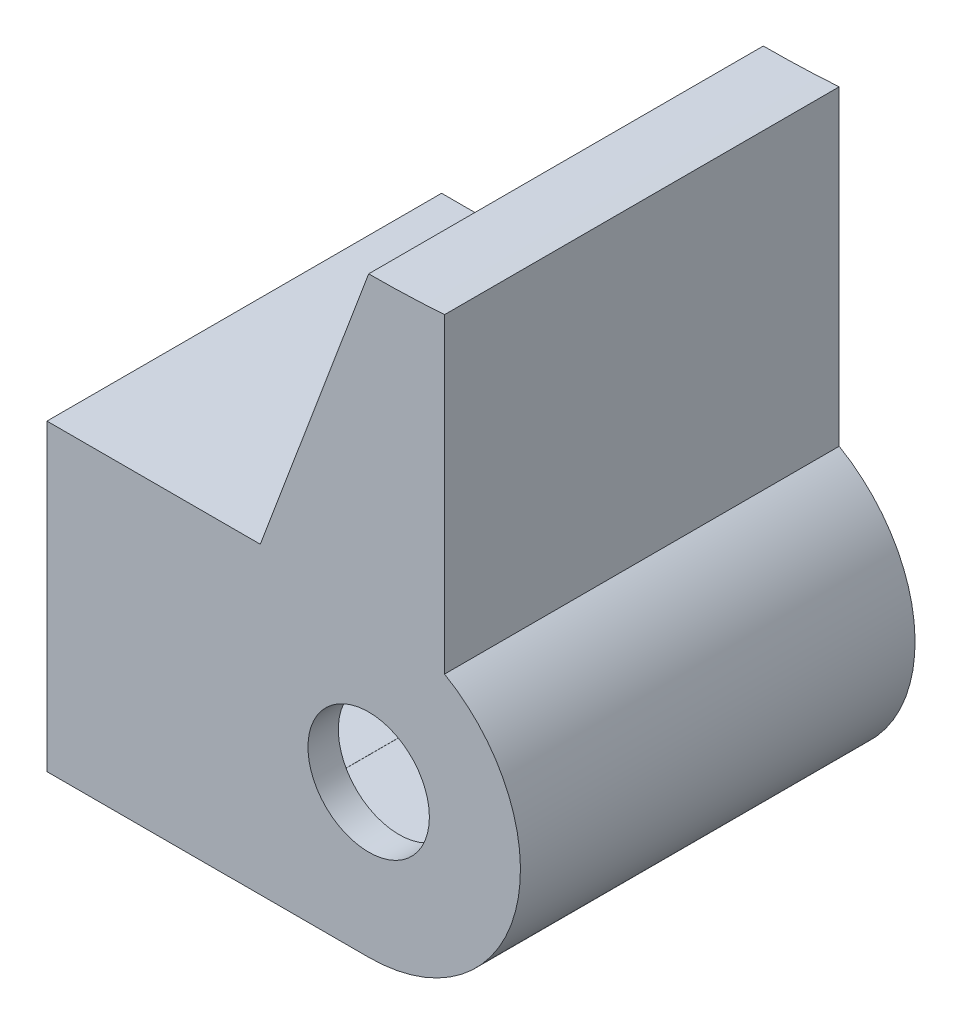
ISO-10303-21;
HEADER;
FILE_DESCRIPTION(('STEP AP214'),'2;1');
FILE_NAME('part.step','',(''),(''),'','','');
FILE_SCHEMA(('AUTOMOTIVE_DESIGN { 1 0 10303 214 1 1 1 1 }'));
ENDSEC;
DATA;
#1=APPLICATION_CONTEXT('core data for automotive mechanical design processes');
#2=APPLICATION_PROTOCOL_DEFINITION('international standard','automotive_design',2000,#1);
#3=PRODUCT_CONTEXT('',#1,'mechanical');
#4=PRODUCT('Part','Part','',(#3));
#5=PRODUCT_RELATED_PRODUCT_CATEGORY('part','',(#4));
#6=PRODUCT_DEFINITION_FORMATION('','',#4);
#7=PRODUCT_DEFINITION_CONTEXT('part definition',#1,'design');
#8=PRODUCT_DEFINITION('design','',#6,#7);
#9=PRODUCT_DEFINITION_SHAPE('','',#8);
#10=(LENGTH_UNIT() NAMED_UNIT(*) SI_UNIT(.MILLI.,.METRE.));
#11=(NAMED_UNIT(*) PLANE_ANGLE_UNIT() SI_UNIT($,.RADIAN.));
#12=(NAMED_UNIT(*) SI_UNIT($,.STERADIAN.) SOLID_ANGLE_UNIT());
#13=UNCERTAINTY_MEASURE_WITH_UNIT(LENGTH_MEASURE(1.E-05),#10,'distance_accuracy_value','');
#14=(GEOMETRIC_REPRESENTATION_CONTEXT(3) GLOBAL_UNCERTAINTY_ASSIGNED_CONTEXT((#13)) GLOBAL_UNIT_ASSIGNED_CONTEXT((#10,
#11,#12)) REPRESENTATION_CONTEXT('',''));
#15=CARTESIAN_POINT('',(0.,0.,0.));
#16=DIRECTION('',(0.,0.,1.));
#17=DIRECTION('',(1.,0.,0.));
#18=AXIS2_PLACEMENT_3D('',#15,#16,#17);
#19=CARTESIAN_POINT('',(645.,43.3012701892221,130.));
#20=DIRECTION('',(-1.,0.,0.));
#21=DIRECTION('',(0.,0.,1.));
#22=AXIS2_PLACEMENT_3D('',#19,#20,#21);
#23=PLANE('',#22);
#24=DIRECTION('',(0.,1.,0.));
#25=VECTOR('',#24,1.);
#26=CARTESIAN_POINT('',(645.,43.3012701892221,0.));
#27=LINE('',#26,#25);
#28=CARTESIAN_POINT('',(645.,43.3012701892221,0.));
#29=VERTEX_POINT('',#28);
#30=CARTESIAN_POINT('',(645.,145.857170879338,0.));
#31=VERTEX_POINT('',#30);
#32=EDGE_CURVE('E149',#29,#31,#27,.T.);
#33=ORIENTED_EDGE('',*,*,#32,.T.);
#34=DIRECTION('',(0.,0.,-1.));
#35=VECTOR('',#34,1.);
#36=CARTESIAN_POINT('',(645.,145.857170879338,130.));
#37=LINE('',#36,#35);
#38=CARTESIAN_POINT('',(645.,145.857170879338,130.));
#39=VERTEX_POINT('',#38);
#40=EDGE_CURVE('E11',#39,#31,#37,.T.);
#41=ORIENTED_EDGE('',*,*,#40,.F.);
#42=DIRECTION('',(0.,1.,0.));
#43=VECTOR('',#42,1.);
#44=CARTESIAN_POINT('',(645.,43.3012701892221,130.));
#45=LINE('',#44,#43);
#46=CARTESIAN_POINT('',(645.,43.3012701892221,130.));
#47=VERTEX_POINT('',#46);
#48=EDGE_CURVE('E99',#47,#39,#45,.T.);
#49=ORIENTED_EDGE('',*,*,#48,.F.);
#50=DIRECTION('',(0.,0.,-1.));
#51=VECTOR('',#50,1.);
#52=CARTESIAN_POINT('',(645.,43.3012701892221,130.));
#53=LINE('',#52,#51);
#54=EDGE_CURVE('E148',#47,#29,#53,.T.);
#55=ORIENTED_EDGE('',*,*,#54,.T.);
#56=EDGE_LOOP('',(#33,#41,#49,#55));
#57=FACE_BOUND('',#56,.T.);
#58=ADVANCED_FACE('F35',(#57),#23,.F.);
#59=CARTESIAN_POINT('',(620.,510.,130.));
#60=DIRECTION('',(0.,0.,-1.));
#61=DIRECTION('',(-1.,0.,0.));
#62=AXIS2_PLACEMENT_3D('',#59,#60,#61);
#63=CYLINDRICAL_SURFACE('',#62,365.);
#64=CARTESIAN_POINT('',(620.,510.,0.));
#65=DIRECTION('',(0.,0.,1.));
#66=DIRECTION('',(1.,0.,0.));
#67=AXIS2_PLACEMENT_3D('',#64,#65,#66);
#68=CIRCLE('',#67,365.);
#69=CARTESIAN_POINT('',(620.,145.,0.));
#70=VERTEX_POINT('',#69);
#71=EDGE_CURVE('E152',#70,#31,#68,.T.);
#72=ORIENTED_EDGE('',*,*,#71,.F.);
#73=DIRECTION('',(0.,0.,-1.));
#74=VECTOR('',#73,1.);
#75=CARTESIAN_POINT('',(620.,145.,130.));
#76=LINE('',#75,#74);
#77=CARTESIAN_POINT('',(620.,145.,130.));
#78=VERTEX_POINT('',#77);
#79=EDGE_CURVE('E42',#78,#70,#76,.T.);
#80=ORIENTED_EDGE('',*,*,#79,.F.);
#81=CARTESIAN_POINT('',(620.,510.,130.));
#82=DIRECTION('',(0.,0.,1.));
#83=DIRECTION('',(1.,0.,0.));
#84=AXIS2_PLACEMENT_3D('',#81,#82,#83);
#85=CIRCLE('',#84,365.);
#86=EDGE_CURVE('E212',#78,#39,#85,.T.);
#87=ORIENTED_EDGE('',*,*,#86,.T.);
#88=ORIENTED_EDGE('',*,*,#40,.T.);
#89=EDGE_LOOP('',(#72,#80,#87,#88));
#90=FACE_BOUND('',#89,.T.);
#91=ADVANCED_FACE('F192',(#90),#63,.F.);
#92=CARTESIAN_POINT('',(584.288816548161,49.9999999999999,130.));
#93=DIRECTION('',(-0.936049699495071,0.351867816196918,0.));
#94=DIRECTION('',(-0.351867816196918,-0.936049699495071,0.));
#95=AXIS2_PLACEMENT_3D('',#92,#93,#94);
#96=PLANE('',#95);
#97=DIRECTION('',(0.351867816196918,0.936049699495071,0.));
#98=VECTOR('',#97,1.);
#99=CARTESIAN_POINT('',(584.288816548161,49.9999999999999,0.));
#100=LINE('',#99,#98);
#101=CARTESIAN_POINT('',(584.288816548161,49.9999999999999,0.));
#102=VERTEX_POINT('',#101);
#103=EDGE_CURVE('E156',#102,#70,#100,.T.);
#104=ORIENTED_EDGE('',*,*,#103,.F.);
#105=DIRECTION('',(0.,0.,-1.));
#106=VECTOR('',#105,1.);
#107=CARTESIAN_POINT('',(584.288816548161,49.9999999999999,130.));
#108=LINE('',#107,#106);
#109=CARTESIAN_POINT('',(584.288816548161,49.9999999999999,130.));
#110=VERTEX_POINT('',#109);
#111=EDGE_CURVE('E182',#110,#102,#108,.T.);
#112=ORIENTED_EDGE('',*,*,#111,.F.);
#113=DIRECTION('',(0.351867816196918,0.936049699495071,0.));
#114=VECTOR('',#113,1.);
#115=CARTESIAN_POINT('',(584.288816548161,49.9999999999999,130.));
#116=LINE('',#115,#114);
#117=EDGE_CURVE('E189',#110,#78,#116,.T.);
#118=ORIENTED_EDGE('',*,*,#117,.T.);
#119=ORIENTED_EDGE('',*,*,#79,.T.);
#120=EDGE_LOOP('',(#104,#112,#118,#119));
#121=FACE_BOUND('',#120,.T.);
#122=ADVANCED_FACE('F187',(#121),#96,.T.);
#123=CARTESIAN_POINT('',(584.288816548161,49.9999999999999,130.));
#124=DIRECTION('',(0.,-1.,0.));
#125=DIRECTION('',(0.,0.,-1.));
#126=AXIS2_PLACEMENT_3D('',#123,#124,#125);
#127=PLANE('',#126);
#128=DIRECTION('',(-1.,0.,0.));
#129=VECTOR('',#128,1.);
#130=CARTESIAN_POINT('',(584.288816548161,49.9999999999999,0.));
#131=LINE('',#130,#129);
#132=CARTESIAN_POINT('',(514.017492235498,49.9999999999999,0.));
#133=VERTEX_POINT('',#132);
#134=EDGE_CURVE('E159',#102,#133,#131,.T.);
#135=ORIENTED_EDGE('',*,*,#134,.T.);
#136=DIRECTION('',(0.,0.,-1.));
#137=VECTOR('',#136,1.);
#138=CARTESIAN_POINT('',(514.017492235498,49.9999999999999,130.));
#139=LINE('',#138,#137);
#140=CARTESIAN_POINT('',(514.017492235498,49.9999999999999,130.));
#141=VERTEX_POINT('',#140);
#142=EDGE_CURVE('E179',#141,#133,#139,.T.);
#143=ORIENTED_EDGE('',*,*,#142,.F.);
#144=DIRECTION('',(-1.,0.,0.));
#145=VECTOR('',#144,1.);
#146=CARTESIAN_POINT('',(584.288816548161,49.9999999999999,130.));
#147=LINE('',#146,#145);
#148=EDGE_CURVE('E208',#110,#141,#147,.T.);
#149=ORIENTED_EDGE('',*,*,#148,.F.);
#150=ORIENTED_EDGE('',*,*,#111,.T.);
#151=EDGE_LOOP('',(#135,#143,#149,#150));
#152=FACE_BOUND('',#151,.T.);
#153=ADVANCED_FACE('F200',(#152),#127,.F.);
#154=CARTESIAN_POINT('',(514.017492235498,22.6759038658315,130.));
#155=DIRECTION('',(1.,0.,0.));
#156=DIRECTION('',(0.,0.,-1.));
#157=AXIS2_PLACEMENT_3D('',#154,#155,#156);
#158=PLANE('',#157);
#159=DIRECTION('',(0.,-1.,0.));
#160=VECTOR('',#159,1.);
#161=CARTESIAN_POINT('',(514.017492235498,22.6759038658315,0.));
#162=LINE('',#161,#160);
#163=CARTESIAN_POINT('',(514.017492235498,39.9999999999999,0.));
#164=VERTEX_POINT('',#163);
#165=EDGE_CURVE('E163',#133,#164,#162,.T.);
#166=ORIENTED_EDGE('',*,*,#165,.T.);
#167=DIRECTION('',(0.,0.,-1.));
#168=VECTOR('',#167,1.);
#169=CARTESIAN_POINT('',(514.017492235498,39.9999999999999,120.));
#170=LINE('',#169,#168);
#171=CARTESIAN_POINT('',(514.017492235498,39.9999999999999,120.));
#172=VERTEX_POINT('',#171);
#173=EDGE_CURVE('E237',#172,#164,#170,.T.);
#174=ORIENTED_EDGE('',*,*,#173,.F.);
#175=DIRECTION('',(0.,1.,0.));
#176=VECTOR('',#175,1.);
#177=CARTESIAN_POINT('',(514.017492235498,39.9999999999999,120.));
#178=LINE('',#177,#176);
#179=CARTESIAN_POINT('',(514.017492235498,-40.0247511001106,120.));
#180=VERTEX_POINT('',#179);
#181=EDGE_CURVE('E282',#180,#172,#178,.T.);
#182=ORIENTED_EDGE('',*,*,#181,.F.);
#183=DIRECTION('',(0.,0.,-1.));
#184=VECTOR('',#183,1.);
#185=CARTESIAN_POINT('',(514.017492235498,-40.0247511001106,120.));
#186=LINE('',#185,#184);
#187=CARTESIAN_POINT('',(514.017492235498,-40.0247511001106,0.));
#188=VERTEX_POINT('',#187);
#189=EDGE_CURVE('E279',#180,#188,#186,.T.);
#190=ORIENTED_EDGE('',*,*,#189,.T.);
#191=CARTESIAN_POINT('',(514.017492235498,-50.0247511001106,0.));
#192=VERTEX_POINT('',#191);
#193=EDGE_CURVE('E162',#188,#192,#162,.T.);
#194=ORIENTED_EDGE('',*,*,#193,.T.);
#195=DIRECTION('',(0.,0.,-1.));
#196=VECTOR('',#195,1.);
#197=CARTESIAN_POINT('',(514.017492235498,-50.0247511001106,130.));
#198=LINE('',#197,#196);
#199=CARTESIAN_POINT('',(514.017492235498,-50.0247511001106,130.));
#200=VERTEX_POINT('',#199);
#201=EDGE_CURVE('E176',#200,#192,#198,.T.);
#202=ORIENTED_EDGE('',*,*,#201,.F.);
#203=DIRECTION('',(0.,-1.,0.));
#204=VECTOR('',#203,1.);
#205=CARTESIAN_POINT('',(514.017492235498,49.9999999999999,130.));
#206=LINE('',#205,#204);
#207=EDGE_CURVE('E143',#141,#200,#206,.T.);
#208=ORIENTED_EDGE('',*,*,#207,.F.);
#209=ORIENTED_EDGE('',*,*,#142,.T.);
#210=EDGE_LOOP('',(#166,#174,#182,#190,#194,#202,#208,#209));
#211=FACE_BOUND('',#210,.T.);
#212=ADVANCED_FACE('F204',(#211),#158,.F.);
#213=CARTESIAN_POINT('',(514.017492235498,-50.0247511001106,130.));
#214=DIRECTION('',(0.,1.,0.));
#215=DIRECTION('',(0.,0.,1.));
#216=AXIS2_PLACEMENT_3D('',#213,#214,#215);
#217=PLANE('',#216);
#218=DIRECTION('',(1.,0.,0.));
#219=VECTOR('',#218,1.);
#220=CARTESIAN_POINT('',(514.017492235498,-50.0247511001106,0.));
#221=LINE('',#220,#219);
#222=CARTESIAN_POINT('',(573.946481720412,-50.0247511001106,0.));
#223=VERTEX_POINT('',#222);
#224=EDGE_CURVE('E166',#192,#223,#221,.T.);
#225=ORIENTED_EDGE('',*,*,#224,.T.);
#226=DIRECTION('',(0.,0.,-1.));
#227=VECTOR('',#226,1.);
#228=CARTESIAN_POINT('',(573.946481720412,-50.0247511001106,130.));
#229=LINE('',#228,#227);
#230=CARTESIAN_POINT('',(573.946481720412,-50.0247511001106,130.));
#231=VERTEX_POINT('',#230);
#232=EDGE_CURVE('E131',#231,#223,#229,.T.);
#233=ORIENTED_EDGE('',*,*,#232,.F.);
#234=DIRECTION('',(1.,0.,0.));
#235=VECTOR('',#234,1.);
#236=CARTESIAN_POINT('',(514.017492235498,-50.0247511001106,130.));
#237=LINE('',#236,#235);
#238=EDGE_CURVE('E140',#200,#231,#237,.T.);
#239=ORIENTED_EDGE('',*,*,#238,.F.);
#240=ORIENTED_EDGE('',*,*,#201,.T.);
#241=EDGE_LOOP('',(#225,#233,#239,#240));
#242=FACE_BOUND('',#241,.T.);
#243=ADVANCED_FACE('F323',(#242),#217,.F.);
#244=CARTESIAN_POINT('',(574.017492235498,-50.,130.));
#245=DIRECTION('',(0.32913492639564,-0.944282902644402,0.));
#246=DIRECTION('',(0.944282902644402,0.32913492639564,0.));
#247=AXIS2_PLACEMENT_3D('',#244,#245,#246);
#248=PLANE('',#247);
#249=DIRECTION('',(-0.944282902644402,-0.32913492639564,0.));
#250=VECTOR('',#249,1.);
#251=CARTESIAN_POINT('',(574.017492235498,-50.,0.));
#252=LINE('',#251,#250);
#253=CARTESIAN_POINT('',(574.017492235498,-50.,0.));
#254=VERTEX_POINT('',#253);
#255=EDGE_CURVE('E128',#254,#223,#252,.T.);
#256=ORIENTED_EDGE('',*,*,#255,.F.);
#257=DIRECTION('',(0.,0.,-1.));
#258=VECTOR('',#257,1.);
#259=CARTESIAN_POINT('',(574.017492235498,-50.,130.));
#260=LINE('',#259,#258);
#261=CARTESIAN_POINT('',(574.017492235498,-50.,130.));
#262=VERTEX_POINT('',#261);
#263=EDGE_CURVE('E122',#262,#254,#260,.T.);
#264=ORIENTED_EDGE('',*,*,#263,.F.);
#265=DIRECTION('',(-0.944282902644402,-0.32913492639564,0.));
#266=VECTOR('',#265,1.);
#267=CARTESIAN_POINT('',(574.017492235498,-50.,130.));
#268=LINE('',#267,#266);
#269=EDGE_CURVE('E126',#262,#231,#268,.T.);
#270=ORIENTED_EDGE('',*,*,#269,.T.);
#271=ORIENTED_EDGE('',*,*,#232,.T.);
#272=EDGE_LOOP('',(#256,#264,#270,#271));
#273=FACE_BOUND('',#272,.T.);
#274=ADVANCED_FACE('F124',(#273),#248,.T.);
#275=CARTESIAN_POINT('',(574.017492235498,-50.,130.));
#276=DIRECTION('',(0.,1.,0.));
#277=DIRECTION('',(0.,0.,1.));
#278=AXIS2_PLACEMENT_3D('',#275,#276,#277);
#279=PLANE('',#278);
#280=DIRECTION('',(1.,0.,0.));
#281=VECTOR('',#280,1.);
#282=CARTESIAN_POINT('',(574.017492235498,-50.,0.));
#283=LINE('',#282,#281);
#284=CARTESIAN_POINT('',(620.,-50.,0.));
#285=VERTEX_POINT('',#284);
#286=EDGE_CURVE('E170',#254,#285,#283,.T.);
#287=ORIENTED_EDGE('',*,*,#286,.T.);
#288=DIRECTION('',(0.,0.,-1.));
#289=VECTOR('',#288,1.);
#290=CARTESIAN_POINT('',(620.,-50.,130.));
#291=LINE('',#290,#289);
#292=CARTESIAN_POINT('',(620.,-50.,130.));
#293=VERTEX_POINT('',#292);
#294=EDGE_CURVE('E132',#293,#285,#291,.T.);
#295=ORIENTED_EDGE('',*,*,#294,.F.);
#296=DIRECTION('',(1.,0.,0.));
#297=VECTOR('',#296,1.);
#298=CARTESIAN_POINT('',(574.017492235498,-50.,130.));
#299=LINE('',#298,#297);
#300=EDGE_CURVE('E135',#262,#293,#299,.T.);
#301=ORIENTED_EDGE('',*,*,#300,.F.);
#302=ORIENTED_EDGE('',*,*,#263,.T.);
#303=EDGE_LOOP('',(#287,#295,#301,#302));
#304=FACE_BOUND('',#303,.T.);
#305=ADVANCED_FACE('F136',(#304),#279,.F.);
#306=CARTESIAN_POINT('',(620.,0.,130.));
#307=DIRECTION('',(0.,0.,-1.));
#308=DIRECTION('',(-1.,0.,0.));
#309=AXIS2_PLACEMENT_3D('',#306,#307,#308);
#310=CYLINDRICAL_SURFACE('',#309,50.);
#311=CARTESIAN_POINT('',(620.,0.,0.));
#312=DIRECTION('',(0.,0.,1.));
#313=DIRECTION('',(1.,0.,0.));
#314=AXIS2_PLACEMENT_3D('',#311,#312,#313);
#315=CIRCLE('',#314,50.);
#316=EDGE_CURVE('E93',#285,#29,#315,.T.);
#317=ORIENTED_EDGE('',*,*,#316,.T.);
#318=ORIENTED_EDGE('',*,*,#54,.F.);
#319=CARTESIAN_POINT('',(620.,0.,130.));
#320=DIRECTION('',(0.,0.,1.));
#321=DIRECTION('',(1.,0.,0.));
#322=AXIS2_PLACEMENT_3D('',#319,#320,#321);
#323=CIRCLE('',#322,50.);
#324=EDGE_CURVE('E58',#293,#47,#323,.T.);
#325=ORIENTED_EDGE('',*,*,#324,.F.);
#326=ORIENTED_EDGE('',*,*,#294,.T.);
#327=EDGE_LOOP('',(#317,#318,#325,#326));
#328=FACE_BOUND('',#327,.T.);
#329=ADVANCED_FACE('F304',(#328),#310,.T.);
#330=CARTESIAN_POINT('',(620.,510.,130.));
#331=DIRECTION('',(0.,0.,1.));
#332=DIRECTION('',(1.,0.,0.));
#333=AXIS2_PLACEMENT_3D('',#330,#331,#332);
#334=PLANE('',#333);
#335=CARTESIAN_POINT('',(620.,0.,130.));
#336=DIRECTION('',(0.,0.,1.));
#337=DIRECTION('',(1.,0.,0.));
#338=AXIS2_PLACEMENT_3D('',#335,#336,#337);
#339=CIRCLE('',#338,20.0000000000001);
#340=CARTESIAN_POINT('',(640.,0.,130.));
#341=VERTEX_POINT('',#340);
#342=EDGE_CURVE('E288',#341,#341,#339,.T.);
#343=ORIENTED_EDGE('',*,*,#342,.F.);
#344=EDGE_LOOP('',(#343));
#345=FACE_BOUND('',#344,.T.);
#346=ORIENTED_EDGE('',*,*,#48,.T.);
#347=ORIENTED_EDGE('',*,*,#86,.F.);
#348=ORIENTED_EDGE('',*,*,#117,.F.);
#349=ORIENTED_EDGE('',*,*,#148,.T.);
#350=ORIENTED_EDGE('',*,*,#207,.T.);
#351=ORIENTED_EDGE('',*,*,#238,.T.);
#352=ORIENTED_EDGE('',*,*,#269,.F.);
#353=ORIENTED_EDGE('',*,*,#300,.T.);
#354=ORIENTED_EDGE('',*,*,#324,.T.);
#355=EDGE_LOOP('',(#346,#347,#348,#349,#350,#351,#352,#353,#354));
#356=FACE_BOUND('',#355,.T.);
#357=ADVANCED_FACE('F138',(#345,#356),#334,.T.);
#358=CARTESIAN_POINT('',(620.,510.,0.));
#359=DIRECTION('',(0.,0.,1.));
#360=DIRECTION('',(1.,0.,0.));
#361=AXIS2_PLACEMENT_3D('',#358,#359,#360);
#362=PLANE('',#361);
#363=DIRECTION('',(-1.,0.,0.));
#364=VECTOR('',#363,1.);
#365=CARTESIAN_POINT('',(584.288816548161,39.9999999999999,0.));
#366=LINE('',#365,#364);
#367=CARTESIAN_POINT('',(591.212938036077,39.9999999999999,0.));
#368=VERTEX_POINT('',#367);
#369=EDGE_CURVE('E220',#368,#164,#366,.T.);
#370=ORIENTED_EDGE('',*,*,#369,.T.);
#371=ORIENTED_EDGE('',*,*,#165,.F.);
#372=ORIENTED_EDGE('',*,*,#134,.F.);
#373=ORIENTED_EDGE('',*,*,#103,.T.);
#374=ORIENTED_EDGE('',*,*,#71,.T.);
#375=ORIENTED_EDGE('',*,*,#32,.F.);
#376=ORIENTED_EDGE('',*,*,#316,.F.);
#377=ORIENTED_EDGE('',*,*,#286,.F.);
#378=ORIENTED_EDGE('',*,*,#255,.T.);
#379=ORIENTED_EDGE('',*,*,#224,.F.);
#380=ORIENTED_EDGE('',*,*,#193,.F.);
#381=DIRECTION('',(1.,0.,0.));
#382=VECTOR('',#381,1.);
#383=CARTESIAN_POINT('',(514.017492235498,-40.0247511001106,0.));
#384=LINE('',#383,#382);
#385=CARTESIAN_POINT('',(572.253647174843,-40.0247511001106,0.));
#386=VERTEX_POINT('',#385);
#387=EDGE_CURVE('E222',#188,#386,#384,.T.);
#388=ORIENTED_EDGE('',*,*,#387,.T.);
#389=DIRECTION('',(-0.944282902644402,-0.32913492639564,0.));
#390=VECTOR('',#389,1.);
#391=CARTESIAN_POINT('',(570.726142971542,-40.557170973556,0.));
#392=LINE('',#391,#390);
#393=CARTESIAN_POINT('',(572.324657689929,-40.,0.));
#394=VERTEX_POINT('',#393);
#395=EDGE_CURVE('E225',#394,#386,#392,.T.);
#396=ORIENTED_EDGE('',*,*,#395,.F.);
#397=DIRECTION('',(1.,0.,0.));
#398=VECTOR('',#397,1.);
#399=CARTESIAN_POINT('',(574.017492235498,-40.,0.));
#400=LINE('',#399,#398);
#401=CARTESIAN_POINT('',(620.,-40.,0.));
#402=VERTEX_POINT('',#401);
#403=EDGE_CURVE('E228',#394,#402,#400,.T.);
#404=ORIENTED_EDGE('',*,*,#403,.T.);
#405=CARTESIAN_POINT('',(620.,0.,0.));
#406=DIRECTION('',(0.,0.,1.));
#407=DIRECTION('',(1.,0.,0.));
#408=AXIS2_PLACEMENT_3D('',#405,#406,#407);
#409=CIRCLE('',#408,40.);
#410=CARTESIAN_POINT('',(635.,37.0809924354784,0.));
#411=VERTEX_POINT('',#410);
#412=EDGE_CURVE('E231',#402,#411,#409,.T.);
#413=ORIENTED_EDGE('',*,*,#412,.T.);
#414=DIRECTION('',(0.,1.,0.));
#415=VECTOR('',#414,1.);
#416=CARTESIAN_POINT('',(635.,43.3012701892221,0.));
#417=LINE('',#416,#415);
#418=CARTESIAN_POINT('',(635.,135.300120096096,0.));
#419=VERTEX_POINT('',#418);
#420=EDGE_CURVE('E218',#411,#419,#417,.T.);
#421=ORIENTED_EDGE('',*,*,#420,.T.);
#422=CARTESIAN_POINT('',(620.,510.,0.));
#423=DIRECTION('',(0.,0.,1.));
#424=DIRECTION('',(1.,0.,0.));
#425=AXIS2_PLACEMENT_3D('',#422,#423,#424);
#426=CIRCLE('',#425,375.);
#427=CARTESIAN_POINT('',(626.948321549469,135.0643777558,0.));
#428=VERTEX_POINT('',#427);
#429=EDGE_CURVE('E215',#428,#419,#426,.T.);
#430=ORIENTED_EDGE('',*,*,#429,.F.);
#431=DIRECTION('',(0.351867816196918,0.936049699495071,0.));
#432=VECTOR('',#431,1.);
#433=CARTESIAN_POINT('',(593.649313543112,46.4813218380307,0.));
#434=LINE('',#433,#432);
#435=EDGE_CURVE('E49',#368,#428,#434,.T.);
#436=ORIENTED_EDGE('',*,*,#435,.F.);
#437=EDGE_LOOP('',(#370,#371,#372,#373,#374,#375,#376,#377,#378,#379,#380,#388,#396,#404,#413,
#421,#430,#436));
#438=FACE_BOUND('',#437,.T.);
#439=ADVANCED_FACE('F197',(#438),#362,.F.);
#440=CARTESIAN_POINT('',(635.,43.3012701892221,130.));
#441=DIRECTION('',(-1.,0.,0.));
#442=DIRECTION('',(0.,0.,1.));
#443=AXIS2_PLACEMENT_3D('',#440,#441,#442);
#444=PLANE('',#443);
#445=ORIENTED_EDGE('',*,*,#420,.F.);
#446=DIRECTION('',(0.,0.,-1.));
#447=VECTOR('',#446,1.);
#448=CARTESIAN_POINT('',(635.,37.0809924354784,120.));
#449=LINE('',#448,#447);
#450=CARTESIAN_POINT('',(635.,37.0809924354784,120.));
#451=VERTEX_POINT('',#450);
#452=EDGE_CURVE('E241',#451,#411,#449,.T.);
#453=ORIENTED_EDGE('',*,*,#452,.F.);
#454=DIRECTION('',(0.,1.,0.));
#455=VECTOR('',#454,1.);
#456=CARTESIAN_POINT('',(635.,43.3012701892221,120.));
#457=LINE('',#456,#455);
#458=CARTESIAN_POINT('',(635.,135.300120096096,120.));
#459=VERTEX_POINT('',#458);
#460=EDGE_CURVE('E234',#451,#459,#457,.T.);
#461=ORIENTED_EDGE('',*,*,#460,.T.);
#462=DIRECTION('',(0.,0.,-1.));
#463=VECTOR('',#462,1.);
#464=CARTESIAN_POINT('',(635.,135.300120096096,120.));
#465=LINE('',#464,#463);
#466=EDGE_CURVE('E153',#459,#419,#465,.T.);
#467=ORIENTED_EDGE('',*,*,#466,.T.);
#468=EDGE_LOOP('',(#445,#453,#461,#467));
#469=FACE_BOUND('',#468,.T.);
#470=ADVANCED_FACE('F310',(#469),#444,.T.);
#471=CARTESIAN_POINT('',(620.,510.,130.));
#472=DIRECTION('',(0.,0.,-1.));
#473=DIRECTION('',(-1.,0.,0.));
#474=AXIS2_PLACEMENT_3D('',#471,#472,#473);
#475=CYLINDRICAL_SURFACE('',#474,375.);
#476=ORIENTED_EDGE('',*,*,#429,.T.);
#477=ORIENTED_EDGE('',*,*,#466,.F.);
#478=CARTESIAN_POINT('',(620.,510.,120.));
#479=DIRECTION('',(0.,0.,1.));
#480=DIRECTION('',(1.,0.,0.));
#481=AXIS2_PLACEMENT_3D('',#478,#479,#480);
#482=CIRCLE('',#481,375.);
#483=CARTESIAN_POINT('',(626.948321549469,135.0643777558,120.));
#484=VERTEX_POINT('',#483);
#485=EDGE_CURVE('E267',#484,#459,#482,.T.);
#486=ORIENTED_EDGE('',*,*,#485,.F.);
#487=DIRECTION('',(0.,0.,-1.));
#488=VECTOR('',#487,1.);
#489=CARTESIAN_POINT('',(626.948321549469,135.0643777558,120.));
#490=LINE('',#489,#488);
#491=EDGE_CURVE('E269',#484,#428,#490,.T.);
#492=ORIENTED_EDGE('',*,*,#491,.T.);
#493=EDGE_LOOP('',(#476,#477,#486,#492));
#494=FACE_BOUND('',#493,.T.);
#495=ADVANCED_FACE('F436',(#494),#475,.T.);
#496=CARTESIAN_POINT('',(593.649313543112,46.4813218380307,130.));
#497=DIRECTION('',(-0.936049699495071,0.351867816196918,0.));
#498=DIRECTION('',(-0.351867816196918,-0.936049699495071,0.));
#499=AXIS2_PLACEMENT_3D('',#496,#497,#498);
#500=PLANE('',#499);
#501=ORIENTED_EDGE('',*,*,#435,.T.);
#502=ORIENTED_EDGE('',*,*,#491,.F.);
#503=DIRECTION('',(0.351867816196918,0.936049699495071,0.));
#504=VECTOR('',#503,1.);
#505=CARTESIAN_POINT('',(593.649313543112,46.4813218380307,120.));
#506=LINE('',#505,#504);
#507=CARTESIAN_POINT('',(591.212938036077,39.9999999999999,120.));
#508=VERTEX_POINT('',#507);
#509=EDGE_CURVE('E264',#508,#484,#506,.T.);
#510=ORIENTED_EDGE('',*,*,#509,.F.);
#511=DIRECTION('',(0.,0.,-1.));
#512=VECTOR('',#511,1.);
#513=CARTESIAN_POINT('',(591.212938036077,39.9999999999999,130.));
#514=LINE('',#513,#512);
#515=EDGE_CURVE('E261',#508,#368,#514,.T.);
#516=ORIENTED_EDGE('',*,*,#515,.T.);
#517=EDGE_LOOP('',(#501,#502,#510,#516));
#518=FACE_BOUND('',#517,.T.);
#519=ADVANCED_FACE('F377',(#518),#500,.F.);
#520=CARTESIAN_POINT('',(584.288816548161,39.9999999999999,130.));
#521=DIRECTION('',(0.,-1.,0.));
#522=DIRECTION('',(0.,0.,-1.));
#523=AXIS2_PLACEMENT_3D('',#520,#521,#522);
#524=PLANE('',#523);
#525=ORIENTED_EDGE('',*,*,#369,.F.);
#526=ORIENTED_EDGE('',*,*,#515,.F.);
#527=DIRECTION('',(-1.,0.,0.));
#528=VECTOR('',#527,1.);
#529=CARTESIAN_POINT('',(584.288816548161,39.9999999999999,120.));
#530=LINE('',#529,#528);
#531=EDGE_CURVE('E258',#508,#172,#530,.T.);
#532=ORIENTED_EDGE('',*,*,#531,.T.);
#533=ORIENTED_EDGE('',*,*,#173,.T.);
#534=EDGE_LOOP('',(#525,#526,#532,#533));
#535=FACE_BOUND('',#534,.T.);
#536=ADVANCED_FACE('F371',(#535),#524,.T.);
#537=CARTESIAN_POINT('',(514.017492235498,-40.0247511001106,130.));
#538=DIRECTION('',(0.,1.,0.));
#539=DIRECTION('',(0.,0.,1.));
#540=AXIS2_PLACEMENT_3D('',#537,#538,#539);
#541=PLANE('',#540);
#542=ORIENTED_EDGE('',*,*,#387,.F.);
#543=ORIENTED_EDGE('',*,*,#189,.F.);
#544=DIRECTION('',(1.,0.,0.));
#545=VECTOR('',#544,1.);
#546=CARTESIAN_POINT('',(514.017492235498,-40.0247511001106,120.));
#547=LINE('',#546,#545);
#548=CARTESIAN_POINT('',(572.253647174843,-40.0247511001106,120.));
#549=VERTEX_POINT('',#548);
#550=EDGE_CURVE('E252',#180,#549,#547,.T.);
#551=ORIENTED_EDGE('',*,*,#550,.T.);
#552=DIRECTION('',(0.,0.,-1.));
#553=VECTOR('',#552,1.);
#554=CARTESIAN_POINT('',(572.253647174843,-40.0247511001106,130.));
#555=LINE('',#554,#553);
#556=EDGE_CURVE('E255',#549,#386,#555,.T.);
#557=ORIENTED_EDGE('',*,*,#556,.T.);
#558=EDGE_LOOP('',(#542,#543,#551,#557));
#559=FACE_BOUND('',#558,.T.);
#560=ADVANCED_FACE('F376',(#559),#541,.T.);
#561=CARTESIAN_POINT('',(570.726142971542,-40.557170973556,130.));
#562=DIRECTION('',(0.32913492639564,-0.944282902644402,0.));
#563=DIRECTION('',(0.944282902644402,0.32913492639564,0.));
#564=AXIS2_PLACEMENT_3D('',#561,#562,#563);
#565=PLANE('',#564);
#566=ORIENTED_EDGE('',*,*,#395,.T.);
#567=ORIENTED_EDGE('',*,*,#556,.F.);
#568=DIRECTION('',(-0.944282902644402,-0.32913492639564,0.));
#569=VECTOR('',#568,1.);
#570=CARTESIAN_POINT('',(570.726142971542,-40.557170973556,120.));
#571=LINE('',#570,#569);
#572=CARTESIAN_POINT('',(572.324657689929,-40.,120.));
#573=VERTEX_POINT('',#572);
#574=EDGE_CURVE('E245',#573,#549,#571,.T.);
#575=ORIENTED_EDGE('',*,*,#574,.F.);
#576=DIRECTION('',(0.,0.,-1.));
#577=VECTOR('',#576,1.);
#578=CARTESIAN_POINT('',(572.324657689929,-40.,130.));
#579=LINE('',#578,#577);
#580=EDGE_CURVE('E249',#573,#394,#579,.T.);
#581=ORIENTED_EDGE('',*,*,#580,.T.);
#582=EDGE_LOOP('',(#566,#567,#575,#581));
#583=FACE_BOUND('',#582,.T.);
#584=ADVANCED_FACE('F389',(#583),#565,.F.);
#585=CARTESIAN_POINT('',(574.017492235498,-40.,130.));
#586=DIRECTION('',(0.,1.,0.));
#587=DIRECTION('',(0.,0.,1.));
#588=AXIS2_PLACEMENT_3D('',#585,#586,#587);
#589=PLANE('',#588);
#590=ORIENTED_EDGE('',*,*,#403,.F.);
#591=ORIENTED_EDGE('',*,*,#580,.F.);
#592=DIRECTION('',(1.,0.,0.));
#593=VECTOR('',#592,1.);
#594=CARTESIAN_POINT('',(574.017492235498,-40.,120.));
#595=LINE('',#594,#593);
#596=CARTESIAN_POINT('',(620.,-40.,120.));
#597=VERTEX_POINT('',#596);
#598=EDGE_CURVE('E242',#573,#597,#595,.T.);
#599=ORIENTED_EDGE('',*,*,#598,.T.);
#600=DIRECTION('',(0.,0.,-1.));
#601=VECTOR('',#600,1.);
#602=CARTESIAN_POINT('',(620.,-40.,130.));
#603=LINE('',#602,#601);
#604=EDGE_CURVE('E246',#597,#402,#603,.T.);
#605=ORIENTED_EDGE('',*,*,#604,.T.);
#606=EDGE_LOOP('',(#590,#591,#599,#605));
#607=FACE_BOUND('',#606,.T.);
#608=ADVANCED_FACE('F416',(#607),#589,.T.);
#609=CARTESIAN_POINT('',(620.,0.,130.));
#610=DIRECTION('',(0.,0.,-1.));
#611=DIRECTION('',(-1.,0.,0.));
#612=AXIS2_PLACEMENT_3D('',#609,#610,#611);
#613=CYLINDRICAL_SURFACE('',#612,40.);
#614=ORIENTED_EDGE('',*,*,#412,.F.);
#615=ORIENTED_EDGE('',*,*,#604,.F.);
#616=CARTESIAN_POINT('',(620.,0.,120.));
#617=DIRECTION('',(0.,0.,1.));
#618=DIRECTION('',(1.,0.,0.));
#619=AXIS2_PLACEMENT_3D('',#616,#617,#618);
#620=CIRCLE('',#619,40.);
#621=EDGE_CURVE('E238',#597,#451,#620,.T.);
#622=ORIENTED_EDGE('',*,*,#621,.T.);
#623=ORIENTED_EDGE('',*,*,#452,.T.);
#624=EDGE_LOOP('',(#614,#615,#622,#623));
#625=FACE_BOUND('',#624,.T.);
#626=ADVANCED_FACE('F357',(#625),#613,.F.);
#627=CARTESIAN_POINT('',(620.,510.,120.));
#628=DIRECTION('',(0.,0.,1.));
#629=DIRECTION('',(1.,0.,0.));
#630=AXIS2_PLACEMENT_3D('',#627,#628,#629);
#631=PLANE('',#630);
#632=CARTESIAN_POINT('',(620.,0.,120.));
#633=DIRECTION('',(0.,0.,1.));
#634=DIRECTION('',(1.,0.,0.));
#635=AXIS2_PLACEMENT_3D('',#632,#633,#634);
#636=CIRCLE('',#635,20.0000000000001);
#637=CARTESIAN_POINT('',(640.,0.,120.));
#638=VERTEX_POINT('',#637);
#639=EDGE_CURVE('E287',#638,#638,#636,.T.);
#640=ORIENTED_EDGE('',*,*,#639,.T.);
#641=EDGE_LOOP('',(#640));
#642=FACE_BOUND('',#641,.T.);
#643=ORIENTED_EDGE('',*,*,#460,.F.);
#644=ORIENTED_EDGE('',*,*,#621,.F.);
#645=ORIENTED_EDGE('',*,*,#598,.F.);
#646=ORIENTED_EDGE('',*,*,#574,.T.);
#647=ORIENTED_EDGE('',*,*,#550,.F.);
#648=ORIENTED_EDGE('',*,*,#181,.T.);
#649=ORIENTED_EDGE('',*,*,#531,.F.);
#650=ORIENTED_EDGE('',*,*,#509,.T.);
#651=ORIENTED_EDGE('',*,*,#485,.T.);
#652=EDGE_LOOP('',(#643,#644,#645,#646,#647,#648,#649,#650,#651));
#653=FACE_BOUND('',#652,.T.);
#654=ADVANCED_FACE('F294',(#642,#653),#631,.F.);
#655=CARTESIAN_POINT('',(620.,0.,120.));
#656=DIRECTION('',(0.,0.,1.));
#657=DIRECTION('',(1.,0.,0.));
#658=AXIS2_PLACEMENT_3D('',#655,#656,#657);
#659=CYLINDRICAL_SURFACE('',#658,20.0000000000001);
#660=ORIENTED_EDGE('',*,*,#639,.F.);
#661=EDGE_LOOP('',(#660));
#662=FACE_BOUND('',#661,.T.);
#663=ORIENTED_EDGE('',*,*,#342,.T.);
#664=EDGE_LOOP('',(#663));
#665=FACE_BOUND('',#664,.T.);
#666=ADVANCED_FACE('F297',(#662,#665),#659,.F.);
#667=CLOSED_SHELL('',(#58,#91,#122,#153,#212,#243,#274,#305,#329,#357,#439,#470,#495,#519,#536,
#560,#584,#608,#626,#654,#666));
#668=MANIFOLD_SOLID_BREP('B2',#667);
#669=ADVANCED_BREP_SHAPE_REPRESENTATION('',(#18,#668),#14);
#670=SHAPE_DEFINITION_REPRESENTATION(#9,#669);
ENDSEC;
END-ISO-10303-21;
